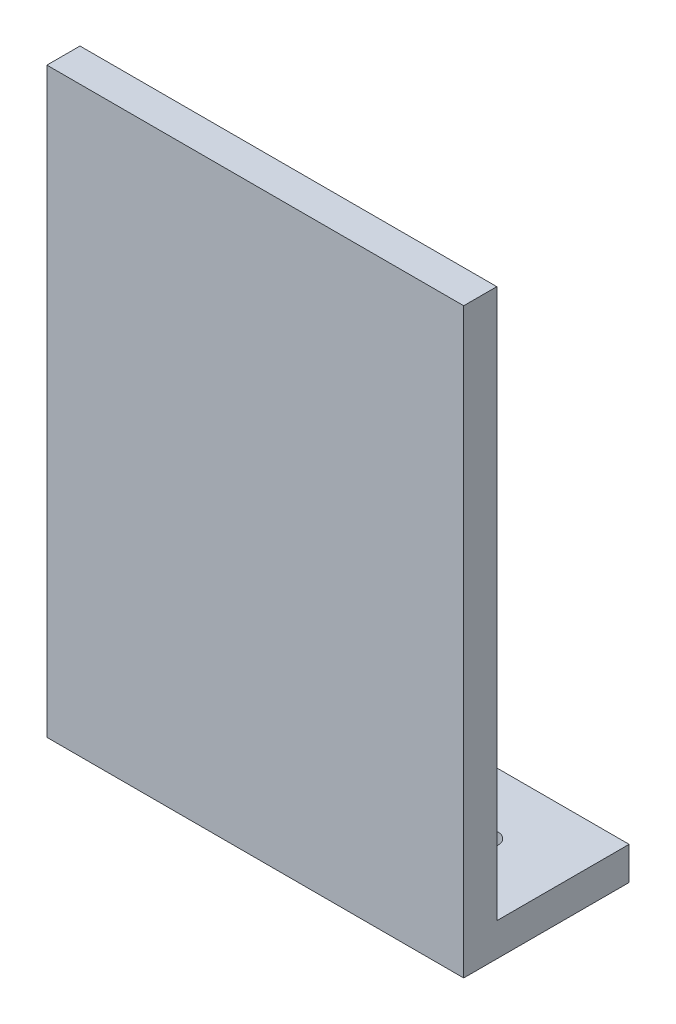
ISO-10303-21;
HEADER;
FILE_DESCRIPTION(('STEP AP214'),'2;1');
FILE_NAME('part.step','',(''),(''),'','','');
FILE_SCHEMA(('AUTOMOTIVE_DESIGN { 1 0 10303 214 1 1 1 1 }'));
ENDSEC;
DATA;
#1=APPLICATION_CONTEXT('core data for automotive mechanical design processes');
#2=APPLICATION_PROTOCOL_DEFINITION('international standard','automotive_design',2000,#1);
#3=PRODUCT_CONTEXT('',#1,'mechanical');
#4=PRODUCT('Part','Part','',(#3));
#5=PRODUCT_RELATED_PRODUCT_CATEGORY('part','',(#4));
#6=PRODUCT_DEFINITION_FORMATION('','',#4);
#7=PRODUCT_DEFINITION_CONTEXT('part definition',#1,'design');
#8=PRODUCT_DEFINITION('design','',#6,#7);
#9=PRODUCT_DEFINITION_SHAPE('','',#8);
#10=(LENGTH_UNIT() NAMED_UNIT(*) SI_UNIT(.MILLI.,.METRE.));
#11=(NAMED_UNIT(*) PLANE_ANGLE_UNIT() SI_UNIT($,.RADIAN.));
#12=(NAMED_UNIT(*) SI_UNIT($,.STERADIAN.) SOLID_ANGLE_UNIT());
#13=UNCERTAINTY_MEASURE_WITH_UNIT(LENGTH_MEASURE(1.E-05),#10,'distance_accuracy_value','');
#14=(GEOMETRIC_REPRESENTATION_CONTEXT(3) GLOBAL_UNCERTAINTY_ASSIGNED_CONTEXT((#13)) GLOBAL_UNIT_ASSIGNED_CONTEXT((#10,
#11,#12)) REPRESENTATION_CONTEXT('',''));
#15=CARTESIAN_POINT('',(0.,0.,0.));
#16=DIRECTION('',(0.,0.,1.));
#17=DIRECTION('',(1.,0.,0.));
#18=AXIS2_PLACEMENT_3D('',#15,#16,#17);
#19=CARTESIAN_POINT('',(0.,0.,5.));
#20=DIRECTION('',(1.,0.,0.));
#21=DIRECTION('',(0.,0.,-1.));
#22=AXIS2_PLACEMENT_3D('',#19,#20,#21);
#23=PLANE('',#22);
#24=DIRECTION('',(0.,-1.,0.));
#25=VECTOR('',#24,1.);
#26=CARTESIAN_POINT('',(0.,0.,0.));
#27=LINE('',#26,#25);
#28=CARTESIAN_POINT('',(0.,88.,0.));
#29=VERTEX_POINT('',#28);
#30=CARTESIAN_POINT('',(0.,5.,0.));
#31=VERTEX_POINT('',#30);
#32=EDGE_CURVE('E120',#29,#31,#27,.T.);
#33=ORIENTED_EDGE('',*,*,#32,.T.);
#34=DIRECTION('',(0.,0.,1.));
#35=VECTOR('',#34,1.);
#36=CARTESIAN_POINT('',(0.,5.,-20.));
#37=LINE('',#36,#35);
#38=CARTESIAN_POINT('',(0.,5.,-20.));
#39=VERTEX_POINT('',#38);
#40=EDGE_CURVE('E103',#39,#31,#37,.T.);
#41=ORIENTED_EDGE('',*,*,#40,.F.);
#42=DIRECTION('',(0.,1.,0.));
#43=VECTOR('',#42,1.);
#44=CARTESIAN_POINT('',(0.,0.,-20.));
#45=LINE('',#44,#43);
#46=CARTESIAN_POINT('',(0.,0.,-20.));
#47=VERTEX_POINT('',#46);
#48=EDGE_CURVE('E110',#47,#39,#45,.T.);
#49=ORIENTED_EDGE('',*,*,#48,.F.);
#50=DIRECTION('',(0.,0.,-1.));
#51=VECTOR('',#50,1.);
#52=CARTESIAN_POINT('',(0.,0.,5.));
#53=LINE('',#52,#51);
#54=CARTESIAN_POINT('',(0.,0.,5.));
#55=VERTEX_POINT('',#54);
#56=EDGE_CURVE('E11',#55,#47,#53,.T.);
#57=ORIENTED_EDGE('',*,*,#56,.F.);
#58=DIRECTION('',(0.,-1.,0.));
#59=VECTOR('',#58,1.);
#60=CARTESIAN_POINT('',(0.,0.,5.));
#61=LINE('',#60,#59);
#62=CARTESIAN_POINT('',(0.,88.,5.));
#63=VERTEX_POINT('',#62);
#64=EDGE_CURVE('E127',#63,#55,#61,.T.);
#65=ORIENTED_EDGE('',*,*,#64,.F.);
#66=DIRECTION('',(0.,0.,-1.));
#67=VECTOR('',#66,1.);
#68=CARTESIAN_POINT('',(0.,88.,5.));
#69=LINE('',#68,#67);
#70=EDGE_CURVE('E132',#63,#29,#69,.T.);
#71=ORIENTED_EDGE('',*,*,#70,.T.);
#72=EDGE_LOOP('',(#33,#41,#49,#57,#65,#71));
#73=FACE_BOUND('',#72,.T.);
#74=ADVANCED_FACE('F38',(#73),#23,.F.);
#75=CARTESIAN_POINT('',(0.,0.,5.));
#76=DIRECTION('',(0.,1.,0.));
#77=DIRECTION('',(0.,0.,1.));
#78=AXIS2_PLACEMENT_3D('',#75,#76,#77);
#79=PLANE('',#78);
#80=CARTESIAN_POINT('',(51.5,0.,-10.));
#81=DIRECTION('',(0.,1.,0.));
#82=DIRECTION('',(-1.,0.,0.));
#83=AXIS2_PLACEMENT_3D('',#80,#81,#82);
#84=CIRCLE('',#83,1.7);
#85=CARTESIAN_POINT('',(49.8,0.,-10.));
#86=VERTEX_POINT('',#85);
#87=EDGE_CURVE('E145',#86,#86,#84,.T.);
#88=ORIENTED_EDGE('',*,*,#87,.T.);
#89=EDGE_LOOP('',(#88));
#90=FACE_BOUND('',#89,.T.);
#91=CARTESIAN_POINT('',(11.5,0.,-9.99999999999999));
#92=DIRECTION('',(0.,1.,0.));
#93=DIRECTION('',(-1.,0.,0.));
#94=AXIS2_PLACEMENT_3D('',#91,#92,#93);
#95=CIRCLE('',#94,1.7);
#96=CARTESIAN_POINT('',(9.79999999999999,0.,-9.99999999999999));
#97=VERTEX_POINT('',#96);
#98=EDGE_CURVE('E157',#97,#97,#95,.T.);
#99=ORIENTED_EDGE('',*,*,#98,.T.);
#100=EDGE_LOOP('',(#99));
#101=FACE_BOUND('',#100,.T.);
#102=ORIENTED_EDGE('',*,*,#56,.T.);
#103=DIRECTION('',(-1.,0.,0.));
#104=VECTOR('',#103,1.);
#105=CARTESIAN_POINT('',(0.,0.,-20.));
#106=LINE('',#105,#104);
#107=CARTESIAN_POINT('',(63.,0.,-20.));
#108=VERTEX_POINT('',#107);
#109=EDGE_CURVE('E116',#108,#47,#106,.T.);
#110=ORIENTED_EDGE('',*,*,#109,.F.);
#111=DIRECTION('',(0.,0.,-1.));
#112=VECTOR('',#111,1.);
#113=CARTESIAN_POINT('',(63.,0.,5.));
#114=LINE('',#113,#112);
#115=CARTESIAN_POINT('',(63.,0.,5.));
#116=VERTEX_POINT('',#115);
#117=EDGE_CURVE('E45',#116,#108,#114,.T.);
#118=ORIENTED_EDGE('',*,*,#117,.F.);
#119=DIRECTION('',(1.,0.,0.));
#120=VECTOR('',#119,1.);
#121=CARTESIAN_POINT('',(0.,0.,5.));
#122=LINE('',#121,#120);
#123=EDGE_CURVE('E83',#55,#116,#122,.T.);
#124=ORIENTED_EDGE('',*,*,#123,.F.);
#125=EDGE_LOOP('',(#102,#110,#118,#124));
#126=FACE_BOUND('',#125,.T.);
#127=ADVANCED_FACE('F143',(#90,#101,#126),#79,.F.);
#128=CARTESIAN_POINT('',(63.,0.,5.));
#129=DIRECTION('',(-1.,0.,0.));
#130=DIRECTION('',(0.,0.,1.));
#131=AXIS2_PLACEMENT_3D('',#128,#129,#130);
#132=PLANE('',#131);
#133=ORIENTED_EDGE('',*,*,#117,.T.);
#134=DIRECTION('',(0.,-1.,0.));
#135=VECTOR('',#134,1.);
#136=CARTESIAN_POINT('',(63.,0.,-20.));
#137=LINE('',#136,#135);
#138=CARTESIAN_POINT('',(63.,4.99999999999999,-20.));
#139=VERTEX_POINT('',#138);
#140=EDGE_CURVE('E109',#139,#108,#137,.T.);
#141=ORIENTED_EDGE('',*,*,#140,.F.);
#142=DIRECTION('',(0.,0.,1.));
#143=VECTOR('',#142,1.);
#144=CARTESIAN_POINT('',(63.,4.99999999999999,-20.));
#145=LINE('',#144,#143);
#146=CARTESIAN_POINT('',(63.,4.99999999999999,0.));
#147=VERTEX_POINT('',#146);
#148=EDGE_CURVE('E105',#139,#147,#145,.T.);
#149=ORIENTED_EDGE('',*,*,#148,.T.);
#150=DIRECTION('',(0.,1.,0.));
#151=VECTOR('',#150,1.);
#152=CARTESIAN_POINT('',(63.,0.,0.));
#153=LINE('',#152,#151);
#154=CARTESIAN_POINT('',(63.,88.,0.));
#155=VERTEX_POINT('',#154);
#156=EDGE_CURVE('E122',#147,#155,#153,.T.);
#157=ORIENTED_EDGE('',*,*,#156,.T.);
#158=DIRECTION('',(0.,0.,-1.));
#159=VECTOR('',#158,1.);
#160=CARTESIAN_POINT('',(63.,88.,5.));
#161=LINE('',#160,#159);
#162=CARTESIAN_POINT('',(63.,88.,5.));
#163=VERTEX_POINT('',#162);
#164=EDGE_CURVE('E137',#163,#155,#161,.T.);
#165=ORIENTED_EDGE('',*,*,#164,.F.);
#166=DIRECTION('',(0.,1.,0.));
#167=VECTOR('',#166,1.);
#168=CARTESIAN_POINT('',(63.,0.,5.));
#169=LINE('',#168,#167);
#170=EDGE_CURVE('E130',#116,#163,#169,.T.);
#171=ORIENTED_EDGE('',*,*,#170,.F.);
#172=EDGE_LOOP('',(#133,#141,#149,#157,#165,#171));
#173=FACE_BOUND('',#172,.T.);
#174=ADVANCED_FACE('F140',(#173),#132,.F.);
#175=CARTESIAN_POINT('',(0.,88.,5.));
#176=DIRECTION('',(0.,-1.,0.));
#177=DIRECTION('',(0.,0.,-1.));
#178=AXIS2_PLACEMENT_3D('',#175,#176,#177);
#179=PLANE('',#178);
#180=DIRECTION('',(-1.,0.,0.));
#181=VECTOR('',#180,1.);
#182=CARTESIAN_POINT('',(0.,88.,0.));
#183=LINE('',#182,#181);
#184=EDGE_CURVE('E76',#155,#29,#183,.T.);
#185=ORIENTED_EDGE('',*,*,#184,.T.);
#186=ORIENTED_EDGE('',*,*,#70,.F.);
#187=DIRECTION('',(-1.,0.,0.));
#188=VECTOR('',#187,1.);
#189=CARTESIAN_POINT('',(0.,88.,5.));
#190=LINE('',#189,#188);
#191=EDGE_CURVE('E61',#163,#63,#190,.T.);
#192=ORIENTED_EDGE('',*,*,#191,.F.);
#193=ORIENTED_EDGE('',*,*,#164,.T.);
#194=EDGE_LOOP('',(#185,#186,#192,#193));
#195=FACE_BOUND('',#194,.T.);
#196=ADVANCED_FACE('F190',(#195),#179,.F.);
#197=CARTESIAN_POINT('',(0.,0.,5.));
#198=DIRECTION('',(0.,0.,-1.));
#199=DIRECTION('',(-1.,0.,0.));
#200=AXIS2_PLACEMENT_3D('',#197,#198,#199);
#201=PLANE('',#200);
#202=ORIENTED_EDGE('',*,*,#64,.T.);
#203=ORIENTED_EDGE('',*,*,#123,.T.);
#204=ORIENTED_EDGE('',*,*,#170,.T.);
#205=ORIENTED_EDGE('',*,*,#191,.T.);
#206=EDGE_LOOP('',(#202,#203,#204,#205));
#207=FACE_BOUND('',#206,.T.);
#208=ADVANCED_FACE('F179',(#207),#201,.F.);
#209=CARTESIAN_POINT('',(0.,0.,0.));
#210=DIRECTION('',(0.,0.,-1.));
#211=DIRECTION('',(-1.,0.,0.));
#212=AXIS2_PLACEMENT_3D('',#209,#210,#211);
#213=PLANE('',#212);
#214=DIRECTION('',(1.,0.,0.));
#215=VECTOR('',#214,1.);
#216=CARTESIAN_POINT('',(0.,5.,0.));
#217=LINE('',#216,#215);
#218=EDGE_CURVE('E52',#31,#147,#217,.T.);
#219=ORIENTED_EDGE('',*,*,#218,.F.);
#220=ORIENTED_EDGE('',*,*,#32,.F.);
#221=ORIENTED_EDGE('',*,*,#184,.F.);
#222=ORIENTED_EDGE('',*,*,#156,.F.);
#223=EDGE_LOOP('',(#219,#220,#221,#222));
#224=FACE_BOUND('',#223,.T.);
#225=ADVANCED_FACE('F170',(#224),#213,.T.);
#226=CARTESIAN_POINT('',(0.,5.,-20.));
#227=DIRECTION('',(0.,-1.,0.));
#228=DIRECTION('',(1.,0.,0.));
#229=AXIS2_PLACEMENT_3D('',#226,#227,#228);
#230=PLANE('',#229);
#231=CARTESIAN_POINT('',(51.5,4.99999999999999,-10.));
#232=DIRECTION('',(0.,1.,0.));
#233=DIRECTION('',(-1.,0.,0.));
#234=AXIS2_PLACEMENT_3D('',#231,#232,#233);
#235=CIRCLE('',#234,1.7);
#236=CARTESIAN_POINT('',(49.8,4.99999999999999,-10.));
#237=VERTEX_POINT('',#236);
#238=EDGE_CURVE('E147',#237,#237,#235,.T.);
#239=ORIENTED_EDGE('',*,*,#238,.F.);
#240=EDGE_LOOP('',(#239));
#241=FACE_BOUND('',#240,.T.);
#242=CARTESIAN_POINT('',(11.5,5.,-9.99999999999999));
#243=DIRECTION('',(0.,1.,0.));
#244=DIRECTION('',(-1.,0.,0.));
#245=AXIS2_PLACEMENT_3D('',#242,#243,#244);
#246=CIRCLE('',#245,1.7);
#247=CARTESIAN_POINT('',(9.79999999999999,5.,-9.99999999999999));
#248=VERTEX_POINT('',#247);
#249=EDGE_CURVE('E152',#248,#248,#246,.T.);
#250=ORIENTED_EDGE('',*,*,#249,.F.);
#251=EDGE_LOOP('',(#250));
#252=FACE_BOUND('',#251,.T.);
#253=ORIENTED_EDGE('',*,*,#218,.T.);
#254=ORIENTED_EDGE('',*,*,#148,.F.);
#255=DIRECTION('',(1.,0.,0.));
#256=VECTOR('',#255,1.);
#257=CARTESIAN_POINT('',(0.,5.,-20.));
#258=LINE('',#257,#256);
#259=EDGE_CURVE('E99',#39,#139,#258,.T.);
#260=ORIENTED_EDGE('',*,*,#259,.F.);
#261=ORIENTED_EDGE('',*,*,#40,.T.);
#262=EDGE_LOOP('',(#253,#254,#260,#261));
#263=FACE_BOUND('',#262,.T.);
#264=ADVANCED_FACE('F101',(#241,#252,#263),#230,.F.);
#265=CARTESIAN_POINT('',(0.,0.,-20.));
#266=DIRECTION('',(0.,0.,-1.));
#267=DIRECTION('',(-1.,0.,0.));
#268=AXIS2_PLACEMENT_3D('',#265,#266,#267);
#269=PLANE('',#268);
#270=ORIENTED_EDGE('',*,*,#48,.T.);
#271=ORIENTED_EDGE('',*,*,#259,.T.);
#272=ORIENTED_EDGE('',*,*,#140,.T.);
#273=ORIENTED_EDGE('',*,*,#109,.T.);
#274=EDGE_LOOP('',(#270,#271,#272,#273));
#275=FACE_BOUND('',#274,.T.);
#276=ADVANCED_FACE('F114',(#275),#269,.T.);
#277=CARTESIAN_POINT('',(11.5,0.,-9.99999999999999));
#278=DIRECTION('',(0.,1.,0.));
#279=DIRECTION('',(-1.,0.,0.));
#280=AXIS2_PLACEMENT_3D('',#277,#278,#279);
#281=CYLINDRICAL_SURFACE('',#280,1.7);
#282=ORIENTED_EDGE('',*,*,#98,.F.);
#283=EDGE_LOOP('',(#282));
#284=FACE_BOUND('',#283,.T.);
#285=ORIENTED_EDGE('',*,*,#249,.T.);
#286=EDGE_LOOP('',(#285));
#287=FACE_BOUND('',#286,.T.);
#288=ADVANCED_FACE('F162',(#284,#287),#281,.F.);
#289=CARTESIAN_POINT('',(51.5,0.,-10.));
#290=DIRECTION('',(0.,1.,0.));
#291=DIRECTION('',(-1.,0.,0.));
#292=AXIS2_PLACEMENT_3D('',#289,#290,#291);
#293=CYLINDRICAL_SURFACE('',#292,1.7);
#294=ORIENTED_EDGE('',*,*,#87,.F.);
#295=EDGE_LOOP('',(#294));
#296=FACE_BOUND('',#295,.T.);
#297=ORIENTED_EDGE('',*,*,#238,.T.);
#298=EDGE_LOOP('',(#297));
#299=FACE_BOUND('',#298,.T.);
#300=ADVANCED_FACE('F165',(#296,#299),#293,.F.);
#301=CLOSED_SHELL('',(#74,#127,#174,#196,#208,#225,#264,#276,#288,#300));
#302=MANIFOLD_SOLID_BREP('B2',#301);
#303=ADVANCED_BREP_SHAPE_REPRESENTATION('',(#18,#302),#14);
#304=SHAPE_DEFINITION_REPRESENTATION(#9,#303);
ENDSEC;
END-ISO-10303-21;
